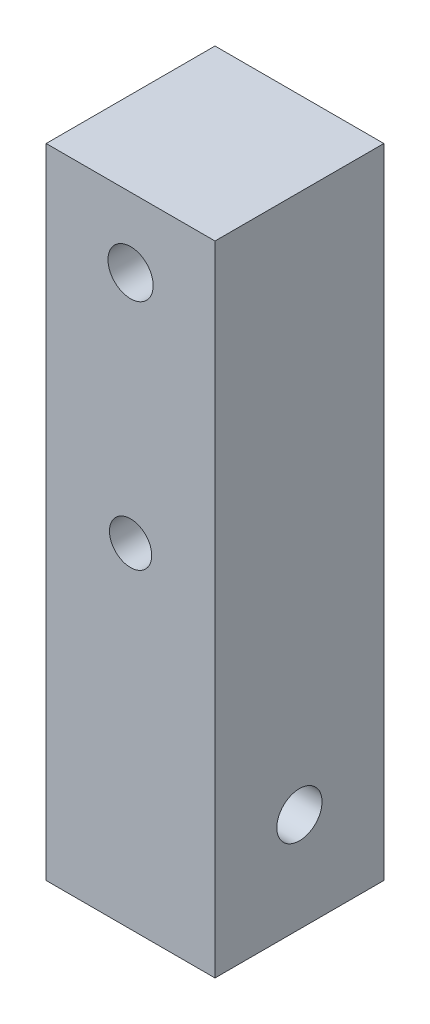
ISO-10303-21;
HEADER;
FILE_DESCRIPTION(('STEP AP214'),'2;1');
FILE_NAME('part.step','',(''),(''),'','','');
FILE_SCHEMA(('AUTOMOTIVE_DESIGN { 1 0 10303 214 1 1 1 1 }'));
ENDSEC;
DATA;
#1=APPLICATION_CONTEXT('core data for automotive mechanical design processes');
#2=APPLICATION_PROTOCOL_DEFINITION('international standard','automotive_design',2000,#1);
#3=PRODUCT_CONTEXT('',#1,'mechanical');
#4=PRODUCT('Part','Part','',(#3));
#5=PRODUCT_RELATED_PRODUCT_CATEGORY('part','',(#4));
#6=PRODUCT_DEFINITION_FORMATION('','',#4);
#7=PRODUCT_DEFINITION_CONTEXT('part definition',#1,'design');
#8=PRODUCT_DEFINITION('design','',#6,#7);
#9=PRODUCT_DEFINITION_SHAPE('','',#8);
#10=(LENGTH_UNIT() NAMED_UNIT(*) SI_UNIT(.MILLI.,.METRE.));
#11=(NAMED_UNIT(*) PLANE_ANGLE_UNIT() SI_UNIT($,.RADIAN.));
#12=(NAMED_UNIT(*) SI_UNIT($,.STERADIAN.) SOLID_ANGLE_UNIT());
#13=UNCERTAINTY_MEASURE_WITH_UNIT(LENGTH_MEASURE(1.E-05),#10,'distance_accuracy_value','');
#14=(GEOMETRIC_REPRESENTATION_CONTEXT(3) GLOBAL_UNCERTAINTY_ASSIGNED_CONTEXT((#13)) GLOBAL_UNIT_ASSIGNED_CONTEXT((#10,
#11,#12)) REPRESENTATION_CONTEXT('',''));
#15=CARTESIAN_POINT('',(0.,0.,0.));
#16=DIRECTION('',(0.,0.,1.));
#17=DIRECTION('',(1.,0.,0.));
#18=AXIS2_PLACEMENT_3D('',#15,#16,#17);
#19=CARTESIAN_POINT('',(6.35,48.006,6.35));
#20=DIRECTION('',(-1.,0.,0.));
#21=DIRECTION('',(0.,0.,1.));
#22=AXIS2_PLACEMENT_3D('',#19,#20,#21);
#23=PLANE('',#22);
#24=CARTESIAN_POINT('',(6.35,7.46125,0.));
#25=DIRECTION('',(1.,0.,0.));
#26=DIRECTION('',(0.,0.,-1.));
#27=AXIS2_PLACEMENT_3D('',#24,#25,#26);
#28=CIRCLE('',#27,1.7);
#29=CARTESIAN_POINT('',(6.35,7.46125,-1.70000000000001));
#30=VERTEX_POINT('',#29);
#31=EDGE_CURVE('E122',#30,#30,#28,.T.);
#32=ORIENTED_EDGE('',*,*,#31,.F.);
#33=EDGE_LOOP('',(#32));
#34=FACE_BOUND('',#33,.T.);
#35=DIRECTION('',(0.,0.,-1.));
#36=VECTOR('',#35,1.);
#37=CARTESIAN_POINT('',(6.35,0.,6.35));
#38=LINE('',#37,#36);
#39=CARTESIAN_POINT('',(6.35,0.,6.35));
#40=VERTEX_POINT('',#39);
#41=CARTESIAN_POINT('',(6.35,0.,-6.35));
#42=VERTEX_POINT('',#41);
#43=EDGE_CURVE('E96',#40,#42,#38,.T.);
#44=ORIENTED_EDGE('',*,*,#43,.T.);
#45=DIRECTION('',(0.,-1.,0.));
#46=VECTOR('',#45,1.);
#47=CARTESIAN_POINT('',(6.35,48.006,-6.35));
#48=LINE('',#47,#46);
#49=CARTESIAN_POINT('',(6.35,48.006,-6.35));
#50=VERTEX_POINT('',#49);
#51=EDGE_CURVE('E11',#50,#42,#48,.T.);
#52=ORIENTED_EDGE('',*,*,#51,.F.);
#53=DIRECTION('',(0.,0.,-1.));
#54=VECTOR('',#53,1.);
#55=CARTESIAN_POINT('',(6.35,48.006,6.35));
#56=LINE('',#55,#54);
#57=CARTESIAN_POINT('',(6.35,48.006,6.35));
#58=VERTEX_POINT('',#57);
#59=EDGE_CURVE('E84',#58,#50,#56,.T.);
#60=ORIENTED_EDGE('',*,*,#59,.F.);
#61=DIRECTION('',(0.,-1.,0.));
#62=VECTOR('',#61,1.);
#63=CARTESIAN_POINT('',(6.35,48.006,6.35));
#64=LINE('',#63,#62);
#65=EDGE_CURVE('E92',#58,#40,#64,.T.);
#66=ORIENTED_EDGE('',*,*,#65,.T.);
#67=EDGE_LOOP('',(#44,#52,#60,#66));
#68=FACE_BOUND('',#67,.T.);
#69=ADVANCED_FACE('F33',(#34,#68),#23,.F.);
#70=CARTESIAN_POINT('',(-6.35,48.006,-6.35));
#71=DIRECTION('',(0.,0.,1.));
#72=DIRECTION('',(1.,0.,0.));
#73=AXIS2_PLACEMENT_3D('',#70,#71,#72);
#74=PLANE('',#73);
#75=CARTESIAN_POINT('',(0.,42.76725,-6.35));
#76=DIRECTION('',(0.,0.,1.));
#77=DIRECTION('',(1.,0.,0.));
#78=AXIS2_PLACEMENT_3D('',#75,#76,#77);
#79=CIRCLE('',#78,1.70000000000001);
#80=CARTESIAN_POINT('',(1.70000000000003,42.76725,-6.35));
#81=VERTEX_POINT('',#80);
#82=EDGE_CURVE('E113',#81,#81,#79,.T.);
#83=ORIENTED_EDGE('',*,*,#82,.T.);
#84=EDGE_LOOP('',(#83));
#85=FACE_BOUND('',#84,.T.);
#86=CARTESIAN_POINT('',(0.,25.146,-6.35));
#87=DIRECTION('',(0.,0.,1.));
#88=DIRECTION('',(1.,0.,0.));
#89=AXIS2_PLACEMENT_3D('',#86,#87,#88);
#90=CIRCLE('',#89,1.5875);
#91=CARTESIAN_POINT('',(1.5875,25.146,-6.35));
#92=VERTEX_POINT('',#91);
#93=EDGE_CURVE('E99',#92,#92,#90,.T.);
#94=ORIENTED_EDGE('',*,*,#93,.T.);
#95=EDGE_LOOP('',(#94));
#96=FACE_BOUND('',#95,.T.);
#97=DIRECTION('',(-1.,0.,0.));
#98=VECTOR('',#97,1.);
#99=CARTESIAN_POINT('',(-6.35,0.,-6.35));
#100=LINE('',#99,#98);
#101=CARTESIAN_POINT('',(-6.35,0.,-6.35));
#102=VERTEX_POINT('',#101);
#103=EDGE_CURVE('E88',#42,#102,#100,.T.);
#104=ORIENTED_EDGE('',*,*,#103,.T.);
#105=DIRECTION('',(0.,-1.,0.));
#106=VECTOR('',#105,1.);
#107=CARTESIAN_POINT('',(-6.35,48.006,-6.35));
#108=LINE('',#107,#106);
#109=CARTESIAN_POINT('',(-6.35,48.006,-6.35));
#110=VERTEX_POINT('',#109);
#111=EDGE_CURVE('E41',#110,#102,#108,.T.);
#112=ORIENTED_EDGE('',*,*,#111,.F.);
#113=DIRECTION('',(-1.,0.,0.));
#114=VECTOR('',#113,1.);
#115=CARTESIAN_POINT('',(-6.35,48.006,-6.35));
#116=LINE('',#115,#114);
#117=EDGE_CURVE('E79',#50,#110,#116,.T.);
#118=ORIENTED_EDGE('',*,*,#117,.F.);
#119=ORIENTED_EDGE('',*,*,#51,.T.);
#120=EDGE_LOOP('',(#104,#112,#118,#119));
#121=FACE_BOUND('',#120,.T.);
#122=ADVANCED_FACE('F87',(#85,#96,#121),#74,.F.);
#123=CARTESIAN_POINT('',(-6.35,48.006,6.35));
#124=DIRECTION('',(1.,0.,0.));
#125=DIRECTION('',(0.,0.,-1.));
#126=AXIS2_PLACEMENT_3D('',#123,#124,#125);
#127=PLANE('',#126);
#128=CARTESIAN_POINT('',(-6.35,7.46125,0.));
#129=DIRECTION('',(1.,0.,0.));
#130=DIRECTION('',(0.,0.,-1.));
#131=AXIS2_PLACEMENT_3D('',#128,#129,#130);
#132=CIRCLE('',#131,1.7);
#133=CARTESIAN_POINT('',(-6.35,7.46125,-1.70000000000001));
#134=VERTEX_POINT('',#133);
#135=EDGE_CURVE('E119',#134,#134,#132,.T.);
#136=ORIENTED_EDGE('',*,*,#135,.T.);
#137=EDGE_LOOP('',(#136));
#138=FACE_BOUND('',#137,.T.);
#139=DIRECTION('',(0.,0.,1.));
#140=VECTOR('',#139,1.);
#141=CARTESIAN_POINT('',(-6.35,0.,6.35));
#142=LINE('',#141,#140);
#143=CARTESIAN_POINT('',(-6.35,0.,6.35));
#144=VERTEX_POINT('',#143);
#145=EDGE_CURVE('E66',#102,#144,#142,.T.);
#146=ORIENTED_EDGE('',*,*,#145,.T.);
#147=DIRECTION('',(0.,-1.,0.));
#148=VECTOR('',#147,1.);
#149=CARTESIAN_POINT('',(-6.35,48.006,6.35));
#150=LINE('',#149,#148);
#151=CARTESIAN_POINT('',(-6.35,48.006,6.35));
#152=VERTEX_POINT('',#151);
#153=EDGE_CURVE('E89',#152,#144,#150,.T.);
#154=ORIENTED_EDGE('',*,*,#153,.F.);
#155=DIRECTION('',(0.,0.,1.));
#156=VECTOR('',#155,1.);
#157=CARTESIAN_POINT('',(-6.35,48.006,6.35));
#158=LINE('',#157,#156);
#159=EDGE_CURVE('E82',#110,#152,#158,.T.);
#160=ORIENTED_EDGE('',*,*,#159,.F.);
#161=ORIENTED_EDGE('',*,*,#111,.T.);
#162=EDGE_LOOP('',(#146,#154,#160,#161));
#163=FACE_BOUND('',#162,.T.);
#164=ADVANCED_FACE('F90',(#138,#163),#127,.F.);
#165=CARTESIAN_POINT('',(-6.35,48.006,6.35));
#166=DIRECTION('',(0.,0.,-1.));
#167=DIRECTION('',(-1.,0.,0.));
#168=AXIS2_PLACEMENT_3D('',#165,#166,#167);
#169=PLANE('',#168);
#170=CARTESIAN_POINT('',(0.,42.76725,6.35));
#171=DIRECTION('',(0.,0.,1.));
#172=DIRECTION('',(1.,0.,0.));
#173=AXIS2_PLACEMENT_3D('',#170,#171,#172);
#174=CIRCLE('',#173,1.70000000000001);
#175=CARTESIAN_POINT('',(1.70000000000003,42.76725,6.35));
#176=VERTEX_POINT('',#175);
#177=EDGE_CURVE('E116',#176,#176,#174,.T.);
#178=ORIENTED_EDGE('',*,*,#177,.F.);
#179=EDGE_LOOP('',(#178));
#180=FACE_BOUND('',#179,.T.);
#181=CARTESIAN_POINT('',(0.,25.146,6.35));
#182=DIRECTION('',(0.,0.,1.));
#183=DIRECTION('',(1.,0.,0.));
#184=AXIS2_PLACEMENT_3D('',#181,#182,#183);
#185=CIRCLE('',#184,1.5875);
#186=CARTESIAN_POINT('',(1.5875,25.146,6.35));
#187=VERTEX_POINT('',#186);
#188=EDGE_CURVE('E110',#187,#187,#185,.T.);
#189=ORIENTED_EDGE('',*,*,#188,.F.);
#190=EDGE_LOOP('',(#189));
#191=FACE_BOUND('',#190,.T.);
#192=DIRECTION('',(1.,0.,0.));
#193=VECTOR('',#192,1.);
#194=CARTESIAN_POINT('',(-6.35,0.,6.35));
#195=LINE('',#194,#193);
#196=EDGE_CURVE('E72',#144,#40,#195,.T.);
#197=ORIENTED_EDGE('',*,*,#196,.T.);
#198=ORIENTED_EDGE('',*,*,#65,.F.);
#199=DIRECTION('',(1.,0.,0.));
#200=VECTOR('',#199,1.);
#201=CARTESIAN_POINT('',(-6.35,48.006,6.35));
#202=LINE('',#201,#200);
#203=EDGE_CURVE('E49',#152,#58,#202,.T.);
#204=ORIENTED_EDGE('',*,*,#203,.F.);
#205=ORIENTED_EDGE('',*,*,#153,.T.);
#206=EDGE_LOOP('',(#197,#198,#204,#205));
#207=FACE_BOUND('',#206,.T.);
#208=ADVANCED_FACE('F104',(#180,#191,#207),#169,.F.);
#209=CARTESIAN_POINT('',(0.,48.006,0.));
#210=DIRECTION('',(0.,-1.,0.));
#211=DIRECTION('',(0.,0.,-1.));
#212=AXIS2_PLACEMENT_3D('',#209,#210,#211);
#213=PLANE('',#212);
#214=ORIENTED_EDGE('',*,*,#59,.T.);
#215=ORIENTED_EDGE('',*,*,#117,.T.);
#216=ORIENTED_EDGE('',*,*,#159,.T.);
#217=ORIENTED_EDGE('',*,*,#203,.T.);
#218=EDGE_LOOP('',(#214,#215,#216,#217));
#219=FACE_BOUND('',#218,.T.);
#220=ADVANCED_FACE('F80',(#219),#213,.F.);
#221=CARTESIAN_POINT('',(0.,0.,0.));
#222=DIRECTION('',(0.,-1.,0.));
#223=DIRECTION('',(0.,0.,-1.));
#224=AXIS2_PLACEMENT_3D('',#221,#222,#223);
#225=PLANE('',#224);
#226=ORIENTED_EDGE('',*,*,#43,.F.);
#227=ORIENTED_EDGE('',*,*,#196,.F.);
#228=ORIENTED_EDGE('',*,*,#145,.F.);
#229=ORIENTED_EDGE('',*,*,#103,.F.);
#230=EDGE_LOOP('',(#226,#227,#228,#229));
#231=FACE_BOUND('',#230,.T.);
#232=ADVANCED_FACE('F107',(#231),#225,.T.);
#233=CARTESIAN_POINT('',(0.,25.146,-6.35));
#234=DIRECTION('',(0.,0.,1.));
#235=DIRECTION('',(1.,0.,0.));
#236=AXIS2_PLACEMENT_3D('',#233,#234,#235);
#237=CYLINDRICAL_SURFACE('',#236,1.5875);
#238=ORIENTED_EDGE('',*,*,#93,.F.);
#239=EDGE_LOOP('',(#238));
#240=FACE_BOUND('',#239,.T.);
#241=ORIENTED_EDGE('',*,*,#188,.T.);
#242=EDGE_LOOP('',(#241));
#243=FACE_BOUND('',#242,.T.);
#244=ADVANCED_FACE('F154',(#240,#243),#237,.F.);
#245=CARTESIAN_POINT('',(0.,42.76725,-6.35));
#246=DIRECTION('',(0.,0.,1.));
#247=DIRECTION('',(1.,0.,0.));
#248=AXIS2_PLACEMENT_3D('',#245,#246,#247);
#249=CYLINDRICAL_SURFACE('',#248,1.70000000000001);
#250=ORIENTED_EDGE('',*,*,#82,.F.);
#251=EDGE_LOOP('',(#250));
#252=FACE_BOUND('',#251,.T.);
#253=ORIENTED_EDGE('',*,*,#177,.T.);
#254=EDGE_LOOP('',(#253));
#255=FACE_BOUND('',#254,.T.);
#256=ADVANCED_FACE('F132',(#252,#255),#249,.F.);
#257=CARTESIAN_POINT('',(-6.35,7.46125,0.));
#258=DIRECTION('',(1.,0.,0.));
#259=DIRECTION('',(0.,0.,-1.));
#260=AXIS2_PLACEMENT_3D('',#257,#258,#259);
#261=CYLINDRICAL_SURFACE('',#260,1.7);
#262=ORIENTED_EDGE('',*,*,#135,.F.);
#263=EDGE_LOOP('',(#262));
#264=FACE_BOUND('',#263,.T.);
#265=ORIENTED_EDGE('',*,*,#31,.T.);
#266=EDGE_LOOP('',(#265));
#267=FACE_BOUND('',#266,.T.);
#268=ADVANCED_FACE('F129',(#264,#267),#261,.F.);
#269=CLOSED_SHELL('',(#69,#122,#164,#208,#220,#232,#244,#256,#268));
#270=MANIFOLD_SOLID_BREP('B2',#269);
#271=ADVANCED_BREP_SHAPE_REPRESENTATION('',(#18,#270),#14);
#272=SHAPE_DEFINITION_REPRESENTATION(#9,#271);
ENDSEC;
END-ISO-10303-21;
